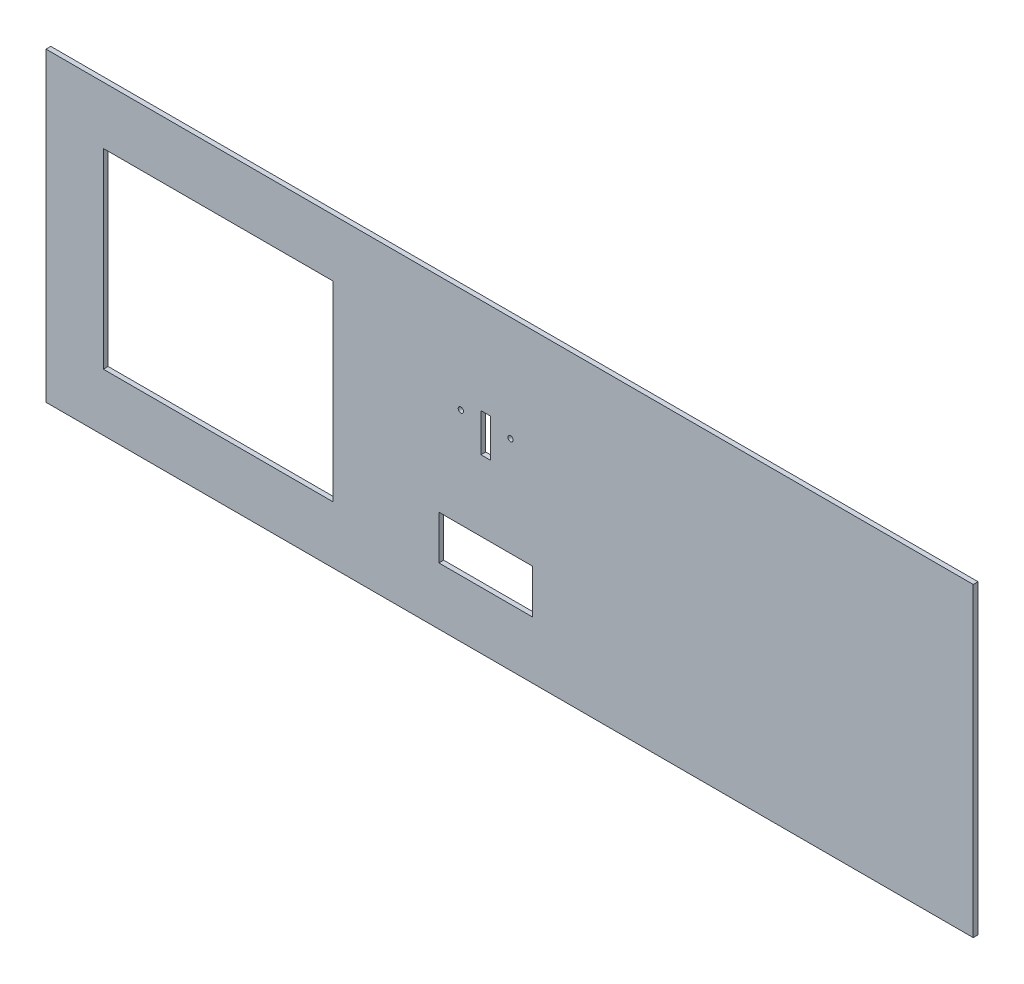
ISO-10303-21;
HEADER;
FILE_DESCRIPTION(('STEP AP214'),'2;1');
FILE_NAME('part.step','',(''),(''),'','','');
FILE_SCHEMA(('AUTOMOTIVE_DESIGN { 1 0 10303 214 1 1 1 1 }'));
ENDSEC;
DATA;
#1=APPLICATION_CONTEXT('core data for automotive mechanical design processes');
#2=APPLICATION_PROTOCOL_DEFINITION('international standard','automotive_design',2000,#1);
#3=PRODUCT_CONTEXT('',#1,'mechanical');
#4=PRODUCT('Part','Part','',(#3));
#5=PRODUCT_RELATED_PRODUCT_CATEGORY('part','',(#4));
#6=PRODUCT_DEFINITION_FORMATION('','',#4);
#7=PRODUCT_DEFINITION_CONTEXT('part definition',#1,'design');
#8=PRODUCT_DEFINITION('design','',#6,#7);
#9=PRODUCT_DEFINITION_SHAPE('','',#8);
#10=(LENGTH_UNIT() NAMED_UNIT(*) SI_UNIT(.MILLI.,.METRE.));
#11=(NAMED_UNIT(*) PLANE_ANGLE_UNIT() SI_UNIT($,.RADIAN.));
#12=(NAMED_UNIT(*) SI_UNIT($,.STERADIAN.) SOLID_ANGLE_UNIT());
#13=UNCERTAINTY_MEASURE_WITH_UNIT(LENGTH_MEASURE(1.E-05),#10,'distance_accuracy_value','');
#14=(GEOMETRIC_REPRESENTATION_CONTEXT(3) GLOBAL_UNCERTAINTY_ASSIGNED_CONTEXT((#13)) GLOBAL_UNIT_ASSIGNED_CONTEXT((#10,
#11,#12)) REPRESENTATION_CONTEXT('',''));
#15=CARTESIAN_POINT('',(0.,0.,0.));
#16=DIRECTION('',(0.,0.,1.));
#17=DIRECTION('',(1.,0.,0.));
#18=AXIS2_PLACEMENT_3D('',#15,#16,#17);
#19=CARTESIAN_POINT('',(307.975,-101.6,3.175));
#20=DIRECTION('',(-1.,0.,0.));
#21=DIRECTION('',(0.,0.,1.));
#22=AXIS2_PLACEMENT_3D('',#19,#20,#21);
#23=PLANE('',#22);
#24=DIRECTION('',(0.,1.,0.));
#25=VECTOR('',#24,1.);
#26=CARTESIAN_POINT('',(307.975,-101.6,0.));
#27=LINE('',#26,#25);
#28=CARTESIAN_POINT('',(307.975,-101.6,0.));
#29=VERTEX_POINT('',#28);
#30=CARTESIAN_POINT('',(307.975,101.6,0.));
#31=VERTEX_POINT('',#30);
#32=EDGE_CURVE('E259',#29,#31,#27,.T.);
#33=ORIENTED_EDGE('',*,*,#32,.T.);
#34=DIRECTION('',(0.,0.,-1.));
#35=VECTOR('',#34,1.);
#36=CARTESIAN_POINT('',(307.975,101.6,3.175));
#37=LINE('',#36,#35);
#38=CARTESIAN_POINT('',(307.975,101.6,3.175));
#39=VERTEX_POINT('',#38);
#40=EDGE_CURVE('E11',#39,#31,#37,.T.);
#41=ORIENTED_EDGE('',*,*,#40,.F.);
#42=DIRECTION('',(0.,1.,0.));
#43=VECTOR('',#42,1.);
#44=CARTESIAN_POINT('',(307.975,-101.6,3.175));
#45=LINE('',#44,#43);
#46=CARTESIAN_POINT('',(307.975,-101.6,3.175));
#47=VERTEX_POINT('',#46);
#48=EDGE_CURVE('E266',#47,#39,#45,.T.);
#49=ORIENTED_EDGE('',*,*,#48,.F.);
#50=DIRECTION('',(0.,0.,-1.));
#51=VECTOR('',#50,1.);
#52=CARTESIAN_POINT('',(307.975,-101.6,3.175));
#53=LINE('',#52,#51);
#54=EDGE_CURVE('E276',#47,#29,#53,.T.);
#55=ORIENTED_EDGE('',*,*,#54,.T.);
#56=EDGE_LOOP('',(#33,#41,#49,#55));
#57=FACE_BOUND('',#56,.T.);
#58=ADVANCED_FACE('F41',(#57),#23,.F.);
#59=CARTESIAN_POINT('',(-307.975,101.6,3.175));
#60=DIRECTION('',(0.,-1.,0.));
#61=DIRECTION('',(0.,0.,-1.));
#62=AXIS2_PLACEMENT_3D('',#59,#60,#61);
#63=PLANE('',#62);
#64=DIRECTION('',(-1.,0.,0.));
#65=VECTOR('',#64,1.);
#66=CARTESIAN_POINT('',(-307.975,101.6,0.));
#67=LINE('',#66,#65);
#68=CARTESIAN_POINT('',(-307.975,101.6,0.));
#69=VERTEX_POINT('',#68);
#70=EDGE_CURVE('E279',#31,#69,#67,.T.);
#71=ORIENTED_EDGE('',*,*,#70,.T.);
#72=DIRECTION('',(0.,0.,-1.));
#73=VECTOR('',#72,1.);
#74=CARTESIAN_POINT('',(-307.975,101.6,3.175));
#75=LINE('',#74,#73);
#76=CARTESIAN_POINT('',(-307.975,101.6,3.175));
#77=VERTEX_POINT('',#76);
#78=EDGE_CURVE('E48',#77,#69,#75,.T.);
#79=ORIENTED_EDGE('',*,*,#78,.F.);
#80=DIRECTION('',(-1.,0.,0.));
#81=VECTOR('',#80,1.);
#82=CARTESIAN_POINT('',(-307.975,101.6,3.175));
#83=LINE('',#82,#81);
#84=EDGE_CURVE('E269',#39,#77,#83,.T.);
#85=ORIENTED_EDGE('',*,*,#84,.F.);
#86=ORIENTED_EDGE('',*,*,#40,.T.);
#87=EDGE_LOOP('',(#71,#79,#85,#86));
#88=FACE_BOUND('',#87,.T.);
#89=ADVANCED_FACE('F308',(#88),#63,.F.);
#90=CARTESIAN_POINT('',(-307.975,-101.6,3.175));
#91=DIRECTION('',(1.,0.,0.));
#92=DIRECTION('',(0.,0.,-1.));
#93=AXIS2_PLACEMENT_3D('',#90,#91,#92);
#94=PLANE('',#93);
#95=DIRECTION('',(0.,-1.,0.));
#96=VECTOR('',#95,1.);
#97=CARTESIAN_POINT('',(-307.975,-101.6,0.));
#98=LINE('',#97,#96);
#99=CARTESIAN_POINT('',(-307.975,-101.6,0.));
#100=VERTEX_POINT('',#99);
#101=EDGE_CURVE('E281',#69,#100,#98,.T.);
#102=ORIENTED_EDGE('',*,*,#101,.T.);
#103=DIRECTION('',(0.,0.,-1.));
#104=VECTOR('',#103,1.);
#105=CARTESIAN_POINT('',(-307.975,-101.6,3.175));
#106=LINE('',#105,#104);
#107=CARTESIAN_POINT('',(-307.975,-101.6,3.175));
#108=VERTEX_POINT('',#107);
#109=EDGE_CURVE('E286',#108,#100,#106,.T.);
#110=ORIENTED_EDGE('',*,*,#109,.F.);
#111=DIRECTION('',(0.,-1.,0.));
#112=VECTOR('',#111,1.);
#113=CARTESIAN_POINT('',(-307.975,-101.6,3.175));
#114=LINE('',#113,#112);
#115=EDGE_CURVE('E272',#77,#108,#114,.T.);
#116=ORIENTED_EDGE('',*,*,#115,.F.);
#117=ORIENTED_EDGE('',*,*,#78,.T.);
#118=EDGE_LOOP('',(#102,#110,#116,#117));
#119=FACE_BOUND('',#118,.T.);
#120=ADVANCED_FACE('F293',(#119),#94,.F.);
#121=CARTESIAN_POINT('',(-307.975,-101.6,3.175));
#122=DIRECTION('',(0.,1.,0.));
#123=DIRECTION('',(0.,0.,1.));
#124=AXIS2_PLACEMENT_3D('',#121,#122,#123);
#125=PLANE('',#124);
#126=DIRECTION('',(1.,0.,0.));
#127=VECTOR('',#126,1.);
#128=CARTESIAN_POINT('',(-307.975,-101.6,0.));
#129=LINE('',#128,#127);
#130=EDGE_CURVE('E270',#100,#29,#129,.T.);
#131=ORIENTED_EDGE('',*,*,#130,.T.);
#132=ORIENTED_EDGE('',*,*,#54,.F.);
#133=DIRECTION('',(1.,0.,0.));
#134=VECTOR('',#133,1.);
#135=CARTESIAN_POINT('',(-307.975,-101.6,3.175));
#136=LINE('',#135,#134);
#137=EDGE_CURVE('E274',#108,#47,#136,.T.);
#138=ORIENTED_EDGE('',*,*,#137,.F.);
#139=ORIENTED_EDGE('',*,*,#109,.T.);
#140=EDGE_LOOP('',(#131,#132,#138,#139));
#141=FACE_BOUND('',#140,.T.);
#142=ADVANCED_FACE('F301',(#141),#125,.F.);
#143=CARTESIAN_POINT('',(0.,0.,3.175));
#144=DIRECTION('',(0.,0.,-1.));
#145=DIRECTION('',(-1.,0.,0.));
#146=AXIS2_PLACEMENT_3D('',#143,#144,#145);
#147=PLANE('',#146);
#148=DIRECTION('',(-1.,0.,0.));
#149=VECTOR('',#148,1.);
#150=CARTESIAN_POINT('',(-46.9899999999999,-34.29,3.175));
#151=LINE('',#150,#149);
#152=CARTESIAN_POINT('',(15.2400000000001,-34.29,3.175));
#153=VERTEX_POINT('',#152);
#154=CARTESIAN_POINT('',(-46.9899999999999,-34.29,3.175));
#155=VERTEX_POINT('',#154);
#156=EDGE_CURVE('E180',#153,#155,#151,.T.);
#157=ORIENTED_EDGE('',*,*,#156,.F.);
#158=DIRECTION('',(0.,1.,0.));
#159=VECTOR('',#158,1.);
#160=CARTESIAN_POINT('',(15.2400000000001,-63.5,3.175));
#161=LINE('',#160,#159);
#162=CARTESIAN_POINT('',(15.2400000000001,-63.5,3.175));
#163=VERTEX_POINT('',#162);
#164=EDGE_CURVE('E55',#163,#153,#161,.T.);
#165=ORIENTED_EDGE('',*,*,#164,.F.);
#166=DIRECTION('',(1.,0.,0.));
#167=VECTOR('',#166,1.);
#168=CARTESIAN_POINT('',(-46.9899999999999,-63.5,3.175));
#169=LINE('',#168,#167);
#170=CARTESIAN_POINT('',(-46.9899999999999,-63.5,3.175));
#171=VERTEX_POINT('',#170);
#172=EDGE_CURVE('E171',#171,#163,#169,.T.);
#173=ORIENTED_EDGE('',*,*,#172,.F.);
#174=DIRECTION('',(0.,-1.,0.));
#175=VECTOR('',#174,1.);
#176=CARTESIAN_POINT('',(-46.9899999999999,-63.5,3.175));
#177=LINE('',#176,#175);
#178=EDGE_CURVE('E174',#155,#171,#177,.T.);
#179=ORIENTED_EDGE('',*,*,#178,.F.);
#180=EDGE_LOOP('',(#157,#165,#173,#179));
#181=FACE_BOUND('',#180,.T.);
#182=CARTESIAN_POINT('',(0.635000000000084,31.75,3.175));
#183=DIRECTION('',(0.,0.,1.));
#184=DIRECTION('',(1.,0.,0.));
#185=AXIS2_PLACEMENT_3D('',#182,#183,#184);
#186=CIRCLE('',#185,1.75);
#187=CARTESIAN_POINT('',(2.38500000000009,31.75,3.175));
#188=VERTEX_POINT('',#187);
#189=EDGE_CURVE('E194',#188,#188,#186,.T.);
#190=ORIENTED_EDGE('',*,*,#189,.F.);
#191=EDGE_LOOP('',(#190));
#192=FACE_BOUND('',#191,.T.);
#193=CARTESIAN_POINT('',(-32.3849999999999,31.75,3.175));
#194=DIRECTION('',(0.,0.,1.));
#195=DIRECTION('',(-1.,0.,0.));
#196=AXIS2_PLACEMENT_3D('',#193,#194,#195);
#197=CIRCLE('',#196,1.75);
#198=CARTESIAN_POINT('',(-34.1349999999999,31.75,3.175));
#199=VERTEX_POINT('',#198);
#200=EDGE_CURVE('E197',#199,#199,#197,.T.);
#201=ORIENTED_EDGE('',*,*,#200,.F.);
#202=EDGE_LOOP('',(#201));
#203=FACE_BOUND('',#202,.T.);
#204=DIRECTION('',(-1.,0.,0.));
#205=VECTOR('',#204,1.);
#206=CARTESIAN_POINT('',(-19.0499999999999,38.1,3.175));
#207=LINE('',#206,#205);
#208=CARTESIAN_POINT('',(-12.6999999999999,38.1,3.175));
#209=VERTEX_POINT('',#208);
#210=CARTESIAN_POINT('',(-19.0499999999999,38.1,3.175));
#211=VERTEX_POINT('',#210);
#212=EDGE_CURVE('E217',#209,#211,#207,.T.);
#213=ORIENTED_EDGE('',*,*,#212,.F.);
#214=DIRECTION('',(0.,1.,0.));
#215=VECTOR('',#214,1.);
#216=CARTESIAN_POINT('',(-12.6999999999999,12.7,3.175));
#217=LINE('',#216,#215);
#218=CARTESIAN_POINT('',(-12.6999999999999,12.7,3.175));
#219=VERTEX_POINT('',#218);
#220=EDGE_CURVE('E193',#219,#209,#217,.T.);
#221=ORIENTED_EDGE('',*,*,#220,.F.);
#222=DIRECTION('',(1.,0.,0.));
#223=VECTOR('',#222,1.);
#224=CARTESIAN_POINT('',(-19.0499999999999,12.7,3.175));
#225=LINE('',#224,#223);
#226=CARTESIAN_POINT('',(-19.0499999999999,12.7,3.175));
#227=VERTEX_POINT('',#226);
#228=EDGE_CURVE('E206',#227,#219,#225,.T.);
#229=ORIENTED_EDGE('',*,*,#228,.F.);
#230=DIRECTION('',(0.,-1.,0.));
#231=VECTOR('',#230,1.);
#232=CARTESIAN_POINT('',(-19.0499999999999,12.7,3.175));
#233=LINE('',#232,#231);
#234=EDGE_CURVE('E220',#211,#227,#233,.T.);
#235=ORIENTED_EDGE('',*,*,#234,.F.);
#236=EDGE_LOOP('',(#213,#221,#229,#235));
#237=FACE_BOUND('',#236,.T.);
#238=DIRECTION('',(1.,0.,0.));
#239=VECTOR('',#238,1.);
#240=CARTESIAN_POINT('',(-269.875,-63.5,3.175));
#241=LINE('',#240,#239);
#242=CARTESIAN_POINT('',(-269.875,-63.5,3.175));
#243=VERTEX_POINT('',#242);
#244=CARTESIAN_POINT('',(-117.475,-63.5,3.175));
#245=VERTEX_POINT('',#244);
#246=EDGE_CURVE('E249',#243,#245,#241,.T.);
#247=ORIENTED_EDGE('',*,*,#246,.F.);
#248=DIRECTION('',(0.,-1.,0.));
#249=VECTOR('',#248,1.);
#250=CARTESIAN_POINT('',(-269.875,-63.5,3.175));
#251=LINE('',#250,#249);
#252=CARTESIAN_POINT('',(-269.875,63.5,3.175));
#253=VERTEX_POINT('',#252);
#254=EDGE_CURVE('E227',#253,#243,#251,.T.);
#255=ORIENTED_EDGE('',*,*,#254,.F.);
#256=DIRECTION('',(-1.,0.,0.));
#257=VECTOR('',#256,1.);
#258=CARTESIAN_POINT('',(-269.875,63.5,3.175));
#259=LINE('',#258,#257);
#260=CARTESIAN_POINT('',(-117.475,63.5,3.175));
#261=VERTEX_POINT('',#260);
#262=EDGE_CURVE('E238',#261,#253,#259,.T.);
#263=ORIENTED_EDGE('',*,*,#262,.F.);
#264=DIRECTION('',(0.,1.,0.));
#265=VECTOR('',#264,1.);
#266=CARTESIAN_POINT('',(-117.475,-63.5,3.175));
#267=LINE('',#266,#265);
#268=EDGE_CURVE('E252',#245,#261,#267,.T.);
#269=ORIENTED_EDGE('',*,*,#268,.F.);
#270=EDGE_LOOP('',(#247,#255,#263,#269));
#271=FACE_BOUND('',#270,.T.);
#272=ORIENTED_EDGE('',*,*,#48,.T.);
#273=ORIENTED_EDGE('',*,*,#84,.T.);
#274=ORIENTED_EDGE('',*,*,#115,.T.);
#275=ORIENTED_EDGE('',*,*,#137,.T.);
#276=EDGE_LOOP('',(#272,#273,#274,#275));
#277=FACE_BOUND('',#276,.T.);
#278=ADVANCED_FACE('F307',(#181,#192,#203,#237,#271,#277),#147,.F.);
#279=CARTESIAN_POINT('',(0.,0.,0.));
#280=DIRECTION('',(0.,0.,-1.));
#281=DIRECTION('',(-1.,0.,0.));
#282=AXIS2_PLACEMENT_3D('',#279,#280,#281);
#283=PLANE('',#282);
#284=DIRECTION('',(0.,1.,0.));
#285=VECTOR('',#284,1.);
#286=CARTESIAN_POINT('',(15.2400000000001,-63.5,0.));
#287=LINE('',#286,#285);
#288=CARTESIAN_POINT('',(15.2400000000001,-63.5,0.));
#289=VERTEX_POINT('',#288);
#290=CARTESIAN_POINT('',(15.2400000000001,-34.29,0.));
#291=VERTEX_POINT('',#290);
#292=EDGE_CURVE('E155',#289,#291,#287,.T.);
#293=ORIENTED_EDGE('',*,*,#292,.T.);
#294=DIRECTION('',(-1.,0.,0.));
#295=VECTOR('',#294,1.);
#296=CARTESIAN_POINT('',(-46.9899999999999,-34.29,0.));
#297=LINE('',#296,#295);
#298=CARTESIAN_POINT('',(-46.9899999999999,-34.29,0.));
#299=VERTEX_POINT('',#298);
#300=EDGE_CURVE('E164',#291,#299,#297,.T.);
#301=ORIENTED_EDGE('',*,*,#300,.T.);
#302=DIRECTION('',(0.,-1.,0.));
#303=VECTOR('',#302,1.);
#304=CARTESIAN_POINT('',(-46.9899999999999,-63.5,0.));
#305=LINE('',#304,#303);
#306=CARTESIAN_POINT('',(-46.9899999999999,-63.5,0.));
#307=VERTEX_POINT('',#306);
#308=EDGE_CURVE('E63',#299,#307,#305,.T.);
#309=ORIENTED_EDGE('',*,*,#308,.T.);
#310=DIRECTION('',(1.,0.,0.));
#311=VECTOR('',#310,1.);
#312=CARTESIAN_POINT('',(-46.9899999999999,-63.5,0.));
#313=LINE('',#312,#311);
#314=EDGE_CURVE('E161',#307,#289,#313,.T.);
#315=ORIENTED_EDGE('',*,*,#314,.T.);
#316=EDGE_LOOP('',(#293,#301,#309,#315));
#317=FACE_BOUND('',#316,.T.);
#318=CARTESIAN_POINT('',(0.635000000000084,31.75,0.));
#319=DIRECTION('',(0.,0.,1.));
#320=DIRECTION('',(1.,0.,0.));
#321=AXIS2_PLACEMENT_3D('',#318,#319,#320);
#322=CIRCLE('',#321,1.75);
#323=CARTESIAN_POINT('',(2.38500000000009,31.75,0.));
#324=VERTEX_POINT('',#323);
#325=EDGE_CURVE('E190',#324,#324,#322,.T.);
#326=ORIENTED_EDGE('',*,*,#325,.T.);
#327=EDGE_LOOP('',(#326));
#328=FACE_BOUND('',#327,.T.);
#329=CARTESIAN_POINT('',(-32.3849999999999,31.75,0.));
#330=DIRECTION('',(0.,0.,1.));
#331=DIRECTION('',(-1.,0.,0.));
#332=AXIS2_PLACEMENT_3D('',#329,#330,#331);
#333=CIRCLE('',#332,1.75);
#334=CARTESIAN_POINT('',(-34.1349999999999,31.75,0.));
#335=VERTEX_POINT('',#334);
#336=EDGE_CURVE('E186',#335,#335,#333,.T.);
#337=ORIENTED_EDGE('',*,*,#336,.T.);
#338=EDGE_LOOP('',(#337));
#339=FACE_BOUND('',#338,.T.);
#340=DIRECTION('',(0.,1.,0.));
#341=VECTOR('',#340,1.);
#342=CARTESIAN_POINT('',(-12.6999999999999,12.7,0.));
#343=LINE('',#342,#341);
#344=CARTESIAN_POINT('',(-12.6999999999999,12.7,0.));
#345=VERTEX_POINT('',#344);
#346=CARTESIAN_POINT('',(-12.6999999999999,38.1,0.));
#347=VERTEX_POINT('',#346);
#348=EDGE_CURVE('E202',#345,#347,#343,.T.);
#349=ORIENTED_EDGE('',*,*,#348,.T.);
#350=DIRECTION('',(-1.,0.,0.));
#351=VECTOR('',#350,1.);
#352=CARTESIAN_POINT('',(-19.0499999999999,38.1,0.));
#353=LINE('',#352,#351);
#354=CARTESIAN_POINT('',(-19.0499999999999,38.1,0.));
#355=VERTEX_POINT('',#354);
#356=EDGE_CURVE('E205',#347,#355,#353,.T.);
#357=ORIENTED_EDGE('',*,*,#356,.T.);
#358=DIRECTION('',(0.,-1.,0.));
#359=VECTOR('',#358,1.);
#360=CARTESIAN_POINT('',(-19.0499999999999,12.7,0.));
#361=LINE('',#360,#359);
#362=CARTESIAN_POINT('',(-19.0499999999999,12.7,0.));
#363=VERTEX_POINT('',#362);
#364=EDGE_CURVE('E209',#355,#363,#361,.T.);
#365=ORIENTED_EDGE('',*,*,#364,.T.);
#366=DIRECTION('',(1.,0.,0.));
#367=VECTOR('',#366,1.);
#368=CARTESIAN_POINT('',(-19.0499999999999,12.7,0.));
#369=LINE('',#368,#367);
#370=EDGE_CURVE('E212',#363,#345,#369,.T.);
#371=ORIENTED_EDGE('',*,*,#370,.T.);
#372=EDGE_LOOP('',(#349,#357,#365,#371));
#373=FACE_BOUND('',#372,.T.);
#374=DIRECTION('',(0.,-1.,0.));
#375=VECTOR('',#374,1.);
#376=CARTESIAN_POINT('',(-269.875,-63.5,0.));
#377=LINE('',#376,#375);
#378=CARTESIAN_POINT('',(-269.875,63.5,0.));
#379=VERTEX_POINT('',#378);
#380=CARTESIAN_POINT('',(-269.875,-63.5,0.));
#381=VERTEX_POINT('',#380);
#382=EDGE_CURVE('E234',#379,#381,#377,.T.);
#383=ORIENTED_EDGE('',*,*,#382,.T.);
#384=DIRECTION('',(1.,0.,0.));
#385=VECTOR('',#384,1.);
#386=CARTESIAN_POINT('',(-269.875,-63.5,0.));
#387=LINE('',#386,#385);
#388=CARTESIAN_POINT('',(-117.475,-63.5,0.));
#389=VERTEX_POINT('',#388);
#390=EDGE_CURVE('E237',#381,#389,#387,.T.);
#391=ORIENTED_EDGE('',*,*,#390,.T.);
#392=DIRECTION('',(0.,1.,0.));
#393=VECTOR('',#392,1.);
#394=CARTESIAN_POINT('',(-117.475,-63.5,0.));
#395=LINE('',#394,#393);
#396=CARTESIAN_POINT('',(-117.475,63.5,0.));
#397=VERTEX_POINT('',#396);
#398=EDGE_CURVE('E241',#389,#397,#395,.T.);
#399=ORIENTED_EDGE('',*,*,#398,.T.);
#400=DIRECTION('',(-1.,0.,0.));
#401=VECTOR('',#400,1.);
#402=CARTESIAN_POINT('',(-269.875,63.5,0.));
#403=LINE('',#402,#401);
#404=EDGE_CURVE('E244',#397,#379,#403,.T.);
#405=ORIENTED_EDGE('',*,*,#404,.T.);
#406=EDGE_LOOP('',(#383,#391,#399,#405));
#407=FACE_BOUND('',#406,.T.);
#408=ORIENTED_EDGE('',*,*,#32,.F.);
#409=ORIENTED_EDGE('',*,*,#130,.F.);
#410=ORIENTED_EDGE('',*,*,#101,.F.);
#411=ORIENTED_EDGE('',*,*,#70,.F.);
#412=EDGE_LOOP('',(#408,#409,#410,#411));
#413=FACE_BOUND('',#412,.T.);
#414=ADVANCED_FACE('F168',(#317,#328,#339,#373,#407,#413),#283,.T.);
#415=CARTESIAN_POINT('',(-269.875,-63.5,0.));
#416=DIRECTION('',(-1.,0.,0.));
#417=DIRECTION('',(0.,0.,1.));
#418=AXIS2_PLACEMENT_3D('',#415,#416,#417);
#419=PLANE('',#418);
#420=ORIENTED_EDGE('',*,*,#254,.T.);
#421=DIRECTION('',(0.,0.,1.));
#422=VECTOR('',#421,1.);
#423=CARTESIAN_POINT('',(-269.875,-63.5,0.));
#424=LINE('',#423,#422);
#425=EDGE_CURVE('E247',#381,#243,#424,.T.);
#426=ORIENTED_EDGE('',*,*,#425,.F.);
#427=ORIENTED_EDGE('',*,*,#382,.F.);
#428=DIRECTION('',(0.,0.,1.));
#429=VECTOR('',#428,1.);
#430=CARTESIAN_POINT('',(-269.875,63.5,0.));
#431=LINE('',#430,#429);
#432=EDGE_CURVE('E257',#379,#253,#431,.T.);
#433=ORIENTED_EDGE('',*,*,#432,.T.);
#434=EDGE_LOOP('',(#420,#426,#427,#433));
#435=FACE_BOUND('',#434,.T.);
#436=ADVANCED_FACE('F320',(#435),#419,.F.);
#437=CARTESIAN_POINT('',(-269.875,63.5,0.));
#438=DIRECTION('',(0.,1.,0.));
#439=DIRECTION('',(0.,0.,1.));
#440=AXIS2_PLACEMENT_3D('',#437,#438,#439);
#441=PLANE('',#440);
#442=ORIENTED_EDGE('',*,*,#262,.T.);
#443=ORIENTED_EDGE('',*,*,#432,.F.);
#444=ORIENTED_EDGE('',*,*,#404,.F.);
#445=DIRECTION('',(0.,0.,1.));
#446=VECTOR('',#445,1.);
#447=CARTESIAN_POINT('',(-117.475,63.5,0.));
#448=LINE('',#447,#446);
#449=EDGE_CURVE('E260',#397,#261,#448,.T.);
#450=ORIENTED_EDGE('',*,*,#449,.T.);
#451=EDGE_LOOP('',(#442,#443,#444,#450));
#452=FACE_BOUND('',#451,.T.);
#453=ADVANCED_FACE('F326',(#452),#441,.F.);
#454=CARTESIAN_POINT('',(-117.475,-63.5,0.));
#455=DIRECTION('',(1.,0.,0.));
#456=DIRECTION('',(0.,0.,-1.));
#457=AXIS2_PLACEMENT_3D('',#454,#455,#456);
#458=PLANE('',#457);
#459=ORIENTED_EDGE('',*,*,#268,.T.);
#460=ORIENTED_EDGE('',*,*,#449,.F.);
#461=ORIENTED_EDGE('',*,*,#398,.F.);
#462=DIRECTION('',(0.,0.,1.));
#463=VECTOR('',#462,1.);
#464=CARTESIAN_POINT('',(-117.475,-63.5,0.));
#465=LINE('',#464,#463);
#466=EDGE_CURVE('E262',#389,#245,#465,.T.);
#467=ORIENTED_EDGE('',*,*,#466,.T.);
#468=EDGE_LOOP('',(#459,#460,#461,#467));
#469=FACE_BOUND('',#468,.T.);
#470=ADVANCED_FACE('F332',(#469),#458,.F.);
#471=CARTESIAN_POINT('',(-269.875,-63.5,0.));
#472=DIRECTION('',(0.,-1.,0.));
#473=DIRECTION('',(0.,0.,-1.));
#474=AXIS2_PLACEMENT_3D('',#471,#472,#473);
#475=PLANE('',#474);
#476=ORIENTED_EDGE('',*,*,#246,.T.);
#477=ORIENTED_EDGE('',*,*,#466,.F.);
#478=ORIENTED_EDGE('',*,*,#390,.F.);
#479=ORIENTED_EDGE('',*,*,#425,.T.);
#480=EDGE_LOOP('',(#476,#477,#478,#479));
#481=FACE_BOUND('',#480,.T.);
#482=ADVANCED_FACE('F328',(#481),#475,.F.);
#483=CARTESIAN_POINT('',(-12.6999999999999,12.7,0.));
#484=DIRECTION('',(1.,0.,0.));
#485=DIRECTION('',(0.,0.,-1.));
#486=AXIS2_PLACEMENT_3D('',#483,#484,#485);
#487=PLANE('',#486);
#488=ORIENTED_EDGE('',*,*,#220,.T.);
#489=DIRECTION('',(0.,0.,1.));
#490=VECTOR('',#489,1.);
#491=CARTESIAN_POINT('',(-12.6999999999999,38.1,0.));
#492=LINE('',#491,#490);
#493=EDGE_CURVE('E215',#347,#209,#492,.T.);
#494=ORIENTED_EDGE('',*,*,#493,.F.);
#495=ORIENTED_EDGE('',*,*,#348,.F.);
#496=DIRECTION('',(0.,0.,1.));
#497=VECTOR('',#496,1.);
#498=CARTESIAN_POINT('',(-12.6999999999999,12.7,0.));
#499=LINE('',#498,#497);
#500=EDGE_CURVE('E225',#345,#219,#499,.T.);
#501=ORIENTED_EDGE('',*,*,#500,.T.);
#502=EDGE_LOOP('',(#488,#494,#495,#501));
#503=FACE_BOUND('',#502,.T.);
#504=ADVANCED_FACE('F331',(#503),#487,.F.);
#505=CARTESIAN_POINT('',(-19.0499999999999,12.7,0.));
#506=DIRECTION('',(0.,-1.,0.));
#507=DIRECTION('',(0.,0.,-1.));
#508=AXIS2_PLACEMENT_3D('',#505,#506,#507);
#509=PLANE('',#508);
#510=ORIENTED_EDGE('',*,*,#228,.T.);
#511=ORIENTED_EDGE('',*,*,#500,.F.);
#512=ORIENTED_EDGE('',*,*,#370,.F.);
#513=DIRECTION('',(0.,0.,1.));
#514=VECTOR('',#513,1.);
#515=CARTESIAN_POINT('',(-19.0499999999999,12.7,0.));
#516=LINE('',#515,#514);
#517=EDGE_CURVE('E228',#363,#227,#516,.T.);
#518=ORIENTED_EDGE('',*,*,#517,.T.);
#519=EDGE_LOOP('',(#510,#511,#512,#518));
#520=FACE_BOUND('',#519,.T.);
#521=ADVANCED_FACE('F342',(#520),#509,.F.);
#522=CARTESIAN_POINT('',(-19.0499999999999,12.7,0.));
#523=DIRECTION('',(-1.,0.,0.));
#524=DIRECTION('',(0.,0.,1.));
#525=AXIS2_PLACEMENT_3D('',#522,#523,#524);
#526=PLANE('',#525);
#527=ORIENTED_EDGE('',*,*,#234,.T.);
#528=ORIENTED_EDGE('',*,*,#517,.F.);
#529=ORIENTED_EDGE('',*,*,#364,.F.);
#530=DIRECTION('',(0.,0.,1.));
#531=VECTOR('',#530,1.);
#532=CARTESIAN_POINT('',(-19.0499999999999,38.1,0.));
#533=LINE('',#532,#531);
#534=EDGE_CURVE('E230',#355,#211,#533,.T.);
#535=ORIENTED_EDGE('',*,*,#534,.T.);
#536=EDGE_LOOP('',(#527,#528,#529,#535));
#537=FACE_BOUND('',#536,.T.);
#538=ADVANCED_FACE('F348',(#537),#526,.F.);
#539=CARTESIAN_POINT('',(-19.0499999999999,38.1,0.));
#540=DIRECTION('',(0.,1.,0.));
#541=DIRECTION('',(0.,0.,1.));
#542=AXIS2_PLACEMENT_3D('',#539,#540,#541);
#543=PLANE('',#542);
#544=ORIENTED_EDGE('',*,*,#212,.T.);
#545=ORIENTED_EDGE('',*,*,#534,.F.);
#546=ORIENTED_EDGE('',*,*,#356,.F.);
#547=ORIENTED_EDGE('',*,*,#493,.T.);
#548=EDGE_LOOP('',(#544,#545,#546,#547));
#549=FACE_BOUND('',#548,.T.);
#550=ADVANCED_FACE('F344',(#549),#543,.F.);
#551=CARTESIAN_POINT('',(-32.3849999999999,31.75,0.));
#552=DIRECTION('',(0.,0.,1.));
#553=DIRECTION('',(1.,0.,0.));
#554=AXIS2_PLACEMENT_3D('',#551,#552,#553);
#555=CYLINDRICAL_SURFACE('',#554,1.75);
#556=ORIENTED_EDGE('',*,*,#336,.F.);
#557=EDGE_LOOP('',(#556));
#558=FACE_BOUND('',#557,.T.);
#559=ORIENTED_EDGE('',*,*,#200,.T.);
#560=EDGE_LOOP('',(#559));
#561=FACE_BOUND('',#560,.T.);
#562=ADVANCED_FACE('F347',(#558,#561),#555,.F.);
#563=CARTESIAN_POINT('',(0.635000000000084,31.75,0.));
#564=DIRECTION('',(0.,0.,1.));
#565=DIRECTION('',(1.,0.,0.));
#566=AXIS2_PLACEMENT_3D('',#563,#564,#565);
#567=CYLINDRICAL_SURFACE('',#566,1.75);
#568=ORIENTED_EDGE('',*,*,#325,.F.);
#569=EDGE_LOOP('',(#568));
#570=FACE_BOUND('',#569,.T.);
#571=ORIENTED_EDGE('',*,*,#189,.T.);
#572=EDGE_LOOP('',(#571));
#573=FACE_BOUND('',#572,.T.);
#574=ADVANCED_FACE('F358',(#570,#573),#567,.F.);
#575=CARTESIAN_POINT('',(15.2400000000001,-63.5,0.));
#576=DIRECTION('',(1.,0.,0.));
#577=DIRECTION('',(0.,0.,-1.));
#578=AXIS2_PLACEMENT_3D('',#575,#576,#577);
#579=PLANE('',#578);
#580=ORIENTED_EDGE('',*,*,#164,.T.);
#581=DIRECTION('',(0.,0.,1.));
#582=VECTOR('',#581,1.);
#583=CARTESIAN_POINT('',(15.2400000000001,-34.29,0.));
#584=LINE('',#583,#582);
#585=EDGE_CURVE('E151',#291,#153,#584,.T.);
#586=ORIENTED_EDGE('',*,*,#585,.F.);
#587=ORIENTED_EDGE('',*,*,#292,.F.);
#588=DIRECTION('',(0.,0.,1.));
#589=VECTOR('',#588,1.);
#590=CARTESIAN_POINT('',(15.2400000000001,-63.5,0.));
#591=LINE('',#590,#589);
#592=EDGE_CURVE('E184',#289,#163,#591,.T.);
#593=ORIENTED_EDGE('',*,*,#592,.T.);
#594=EDGE_LOOP('',(#580,#586,#587,#593));
#595=FACE_BOUND('',#594,.T.);
#596=ADVANCED_FACE('F153',(#595),#579,.F.);
#597=CARTESIAN_POINT('',(-46.9899999999999,-63.5,0.));
#598=DIRECTION('',(0.,-1.,0.));
#599=DIRECTION('',(0.,0.,-1.));
#600=AXIS2_PLACEMENT_3D('',#597,#598,#599);
#601=PLANE('',#600);
#602=ORIENTED_EDGE('',*,*,#172,.T.);
#603=ORIENTED_EDGE('',*,*,#592,.F.);
#604=ORIENTED_EDGE('',*,*,#314,.F.);
#605=DIRECTION('',(0.,0.,1.));
#606=VECTOR('',#605,1.);
#607=CARTESIAN_POINT('',(-46.9899999999999,-63.5,0.));
#608=LINE('',#607,#606);
#609=EDGE_CURVE('E187',#307,#171,#608,.T.);
#610=ORIENTED_EDGE('',*,*,#609,.T.);
#611=EDGE_LOOP('',(#602,#603,#604,#610));
#612=FACE_BOUND('',#611,.T.);
#613=ADVANCED_FACE('F365',(#612),#601,.F.);
#614=CARTESIAN_POINT('',(-46.9899999999999,-63.5,0.));
#615=DIRECTION('',(-1.,0.,0.));
#616=DIRECTION('',(0.,0.,1.));
#617=AXIS2_PLACEMENT_3D('',#614,#615,#616);
#618=PLANE('',#617);
#619=ORIENTED_EDGE('',*,*,#178,.T.);
#620=ORIENTED_EDGE('',*,*,#609,.F.);
#621=ORIENTED_EDGE('',*,*,#308,.F.);
#622=DIRECTION('',(0.,0.,1.));
#623=VECTOR('',#622,1.);
#624=CARTESIAN_POINT('',(-46.9899999999999,-34.29,0.));
#625=LINE('',#624,#623);
#626=EDGE_CURVE('E160',#299,#155,#625,.T.);
#627=ORIENTED_EDGE('',*,*,#626,.T.);
#628=EDGE_LOOP('',(#619,#620,#621,#627));
#629=FACE_BOUND('',#628,.T.);
#630=ADVANCED_FACE('F368',(#629),#618,.F.);
#631=CARTESIAN_POINT('',(-46.9899999999999,-34.29,0.));
#632=DIRECTION('',(0.,1.,0.));
#633=DIRECTION('',(0.,0.,1.));
#634=AXIS2_PLACEMENT_3D('',#631,#632,#633);
#635=PLANE('',#634);
#636=ORIENTED_EDGE('',*,*,#156,.T.);
#637=ORIENTED_EDGE('',*,*,#626,.F.);
#638=ORIENTED_EDGE('',*,*,#300,.F.);
#639=ORIENTED_EDGE('',*,*,#585,.T.);
#640=EDGE_LOOP('',(#636,#637,#638,#639));
#641=FACE_BOUND('',#640,.T.);
#642=ADVANCED_FACE('F165',(#641),#635,.F.);
#643=CLOSED_SHELL('',(#58,#89,#120,#142,#278,#414,#436,#453,#470,#482,#504,#521,#538,#550,#562,
#574,#596,#613,#630,#642));
#644=MANIFOLD_SOLID_BREP('B2',#643);
#645=ADVANCED_BREP_SHAPE_REPRESENTATION('',(#18,#644),#14);
#646=SHAPE_DEFINITION_REPRESENTATION(#9,#645);
ENDSEC;
END-ISO-10303-21;
